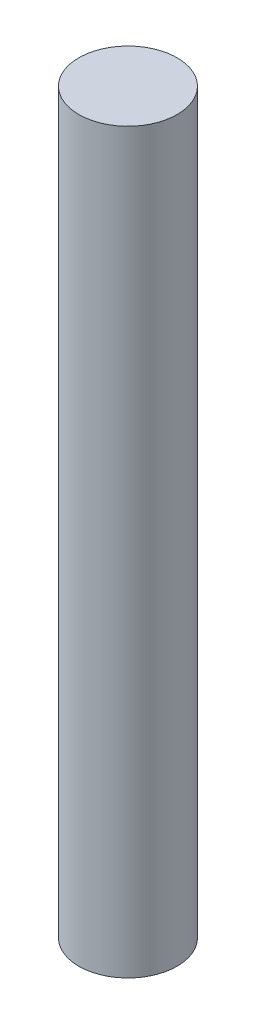
ISO-10303-21;
HEADER;
FILE_DESCRIPTION(('STEP AP214'),'2;1');
FILE_NAME('part.step','',(''),(''),'','','');
FILE_SCHEMA(('AUTOMOTIVE_DESIGN { 1 0 10303 214 1 1 1 1 }'));
ENDSEC;
DATA;
#1=APPLICATION_CONTEXT('core data for automotive mechanical design processes');
#2=APPLICATION_PROTOCOL_DEFINITION('international standard','automotive_design',2000,#1);
#3=PRODUCT_CONTEXT('',#1,'mechanical');
#4=PRODUCT('Part','Part','',(#3));
#5=PRODUCT_RELATED_PRODUCT_CATEGORY('part','',(#4));
#6=PRODUCT_DEFINITION_FORMATION('','',#4);
#7=PRODUCT_DEFINITION_CONTEXT('part definition',#1,'design');
#8=PRODUCT_DEFINITION('design','',#6,#7);
#9=PRODUCT_DEFINITION_SHAPE('','',#8);
#10=(LENGTH_UNIT() NAMED_UNIT(*) SI_UNIT(.MILLI.,.METRE.));
#11=(NAMED_UNIT(*) PLANE_ANGLE_UNIT() SI_UNIT($,.RADIAN.));
#12=(NAMED_UNIT(*) SI_UNIT($,.STERADIAN.) SOLID_ANGLE_UNIT());
#13=UNCERTAINTY_MEASURE_WITH_UNIT(LENGTH_MEASURE(1.E-05),#10,'distance_accuracy_value','');
#14=(GEOMETRIC_REPRESENTATION_CONTEXT(3) GLOBAL_UNCERTAINTY_ASSIGNED_CONTEXT((#13)) GLOBAL_UNIT_ASSIGNED_CONTEXT((#10,
#11,#12)) REPRESENTATION_CONTEXT('',''));
#15=CARTESIAN_POINT('',(0.,0.,0.));
#16=DIRECTION('',(0.,0.,1.));
#17=DIRECTION('',(1.,0.,0.));
#18=AXIS2_PLACEMENT_3D('',#15,#16,#17);
#19=CARTESIAN_POINT('',(0.,150.,0.));
#20=DIRECTION('',(0.,-1.,0.));
#21=DIRECTION('',(0.,0.,-1.));
#22=AXIS2_PLACEMENT_3D('',#19,#20,#21);
#23=CYLINDRICAL_SURFACE('',#22,10.);
#24=CARTESIAN_POINT('',(0.,150.,0.));
#25=DIRECTION('',(0.,1.,0.));
#26=DIRECTION('',(0.,0.,1.));
#27=AXIS2_PLACEMENT_3D('',#24,#25,#26);
#28=CIRCLE('',#27,10.);
#29=CARTESIAN_POINT('',(0.,150.,10.));
#30=VERTEX_POINT('',#29);
#31=EDGE_CURVE('E10',#30,#30,#28,.T.);
#32=ORIENTED_EDGE('',*,*,#31,.F.);
#33=EDGE_LOOP('',(#32));
#34=FACE_BOUND('',#33,.T.);
#35=CARTESIAN_POINT('',(0.,0.,0.));
#36=DIRECTION('',(0.,1.,0.));
#37=DIRECTION('',(0.,0.,1.));
#38=AXIS2_PLACEMENT_3D('',#35,#36,#37);
#39=CIRCLE('',#38,10.);
#40=CARTESIAN_POINT('',(0.,0.,10.));
#41=VERTEX_POINT('',#40);
#42=EDGE_CURVE('E42',#41,#41,#39,.T.);
#43=ORIENTED_EDGE('',*,*,#42,.T.);
#44=EDGE_LOOP('',(#43));
#45=FACE_BOUND('',#44,.T.);
#46=ADVANCED_FACE('F39',(#34,#45),#23,.T.);
#47=CARTESIAN_POINT('',(0.,150.,0.));
#48=DIRECTION('',(0.,1.,0.));
#49=DIRECTION('',(0.,0.,1.));
#50=AXIS2_PLACEMENT_3D('',#47,#48,#49);
#51=PLANE('',#50);
#52=ORIENTED_EDGE('',*,*,#31,.T.);
#53=EDGE_LOOP('',(#52));
#54=FACE_BOUND('',#53,.T.);
#55=ADVANCED_FACE('F54',(#54),#51,.T.);
#56=CARTESIAN_POINT('',(0.,0.,0.));
#57=DIRECTION('',(0.,1.,0.));
#58=DIRECTION('',(0.,0.,1.));
#59=AXIS2_PLACEMENT_3D('',#56,#57,#58);
#60=PLANE('',#59);
#61=ORIENTED_EDGE('',*,*,#42,.F.);
#62=EDGE_LOOP('',(#61));
#63=FACE_BOUND('',#62,.T.);
#64=ADVANCED_FACE('F52',(#63),#60,.F.);
#65=CLOSED_SHELL('',(#46,#55,#64));
#66=MANIFOLD_SOLID_BREP('B2',#65);
#67=ADVANCED_BREP_SHAPE_REPRESENTATION('',(#18,#66),#14);
#68=SHAPE_DEFINITION_REPRESENTATION(#9,#67);
ENDSEC;
END-ISO-10303-21;
